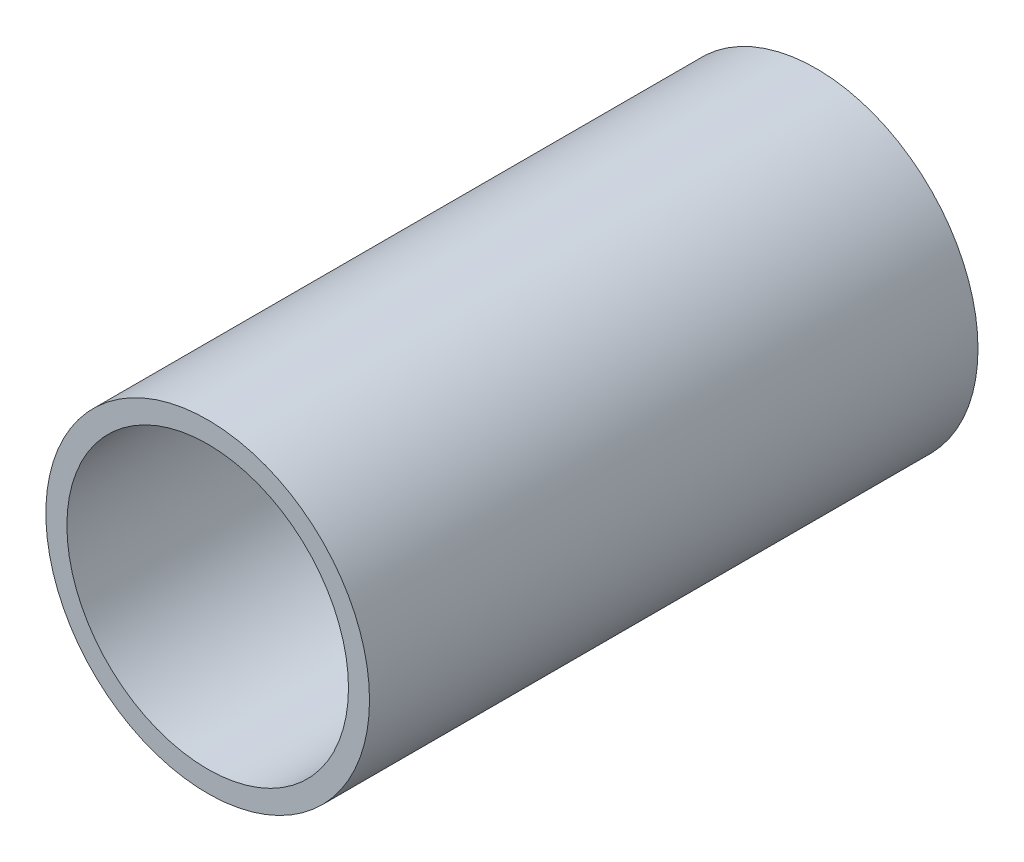
ISO-10303-21;
HEADER;
FILE_DESCRIPTION(('STEP AP214'),'2;1');
FILE_NAME('part.step','',(''),(''),'','','');
FILE_SCHEMA(('AUTOMOTIVE_DESIGN { 1 0 10303 214 1 1 1 1 }'));
ENDSEC;
DATA;
#1=APPLICATION_CONTEXT('core data for automotive mechanical design processes');
#2=APPLICATION_PROTOCOL_DEFINITION('international standard','automotive_design',2000,#1);
#3=PRODUCT_CONTEXT('',#1,'mechanical');
#4=PRODUCT('Part','Part','',(#3));
#5=PRODUCT_RELATED_PRODUCT_CATEGORY('part','',(#4));
#6=PRODUCT_DEFINITION_FORMATION('','',#4);
#7=PRODUCT_DEFINITION_CONTEXT('part definition',#1,'design');
#8=PRODUCT_DEFINITION('design','',#6,#7);
#9=PRODUCT_DEFINITION_SHAPE('','',#8);
#10=(LENGTH_UNIT() NAMED_UNIT(*) SI_UNIT(.MILLI.,.METRE.));
#11=(NAMED_UNIT(*) PLANE_ANGLE_UNIT() SI_UNIT($,.RADIAN.));
#12=(NAMED_UNIT(*) SI_UNIT($,.STERADIAN.) SOLID_ANGLE_UNIT());
#13=UNCERTAINTY_MEASURE_WITH_UNIT(LENGTH_MEASURE(1.E-05),#10,'distance_accuracy_value','');
#14=(GEOMETRIC_REPRESENTATION_CONTEXT(3) GLOBAL_UNCERTAINTY_ASSIGNED_CONTEXT((#13)) GLOBAL_UNIT_ASSIGNED_CONTEXT((#10,
#11,#12)) REPRESENTATION_CONTEXT('',''));
#15=CARTESIAN_POINT('',(0.,0.,0.));
#16=DIRECTION('',(0.,0.,1.));
#17=DIRECTION('',(1.,0.,0.));
#18=AXIS2_PLACEMENT_3D('',#15,#16,#17);
#19=CARTESIAN_POINT('',(0.,0.,23.876));
#20=DIRECTION('',(0.,0.,1.));
#21=DIRECTION('',(-1.,0.,0.));
#22=AXIS2_PLACEMENT_3D('',#19,#20,#21);
#23=CYLINDRICAL_SURFACE('',#22,12.7);
#24=CARTESIAN_POINT('',(0.,0.,-23.876));
#25=DIRECTION('',(0.,0.,-1.));
#26=DIRECTION('',(1.,0.,0.));
#27=AXIS2_PLACEMENT_3D('',#24,#25,#26);
#28=CIRCLE('',#27,12.7);
#29=CARTESIAN_POINT('',(12.7,0.,-23.876));
#30=VERTEX_POINT('',#29);
#31=EDGE_CURVE('E39',#30,#30,#28,.T.);
#32=ORIENTED_EDGE('',*,*,#31,.F.);
#33=EDGE_LOOP('',(#32));
#34=FACE_BOUND('',#33,.T.);
#35=CARTESIAN_POINT('',(0.,0.,23.876));
#36=DIRECTION('',(0.,0.,-1.));
#37=DIRECTION('',(1.,0.,0.));
#38=AXIS2_PLACEMENT_3D('',#35,#36,#37);
#39=CIRCLE('',#38,12.7);
#40=CARTESIAN_POINT('',(12.7,0.,23.876));
#41=VERTEX_POINT('',#40);
#42=EDGE_CURVE('E11',#41,#41,#39,.T.);
#43=ORIENTED_EDGE('',*,*,#42,.T.);
#44=EDGE_LOOP('',(#43));
#45=FACE_BOUND('',#44,.T.);
#46=ADVANCED_FACE('F17',(#34,#45),#23,.T.);
#47=CARTESIAN_POINT('',(0.,0.,23.876));
#48=DIRECTION('',(0.,0.,1.));
#49=DIRECTION('',(-1.,0.,0.));
#50=AXIS2_PLACEMENT_3D('',#47,#48,#49);
#51=CYLINDRICAL_SURFACE('',#50,11.049);
#52=CARTESIAN_POINT('',(0.,0.,-23.876));
#53=DIRECTION('',(0.,0.,-1.));
#54=DIRECTION('',(-1.,0.,0.));
#55=AXIS2_PLACEMENT_3D('',#52,#53,#54);
#56=CIRCLE('',#55,11.049);
#57=CARTESIAN_POINT('',(-11.049,0.,-23.876));
#58=VERTEX_POINT('',#57);
#59=EDGE_CURVE('E27',#58,#58,#56,.T.);
#60=ORIENTED_EDGE('',*,*,#59,.T.);
#61=EDGE_LOOP('',(#60));
#62=FACE_BOUND('',#61,.T.);
#63=CARTESIAN_POINT('',(0.,0.,23.876));
#64=DIRECTION('',(0.,0.,-1.));
#65=DIRECTION('',(-1.,0.,0.));
#66=AXIS2_PLACEMENT_3D('',#63,#64,#65);
#67=CIRCLE('',#66,11.049);
#68=CARTESIAN_POINT('',(-11.049,0.,23.876));
#69=VERTEX_POINT('',#68);
#70=EDGE_CURVE('E20',#69,#69,#67,.T.);
#71=ORIENTED_EDGE('',*,*,#70,.F.);
#72=EDGE_LOOP('',(#71));
#73=FACE_BOUND('',#72,.T.);
#74=ADVANCED_FACE('F54',(#62,#73),#51,.F.);
#75=CARTESIAN_POINT('',(0.,0.,-23.876));
#76=DIRECTION('',(0.,0.,-1.));
#77=DIRECTION('',(0.,-1.,0.));
#78=AXIS2_PLACEMENT_3D('',#75,#76,#77);
#79=PLANE('',#78);
#80=ORIENTED_EDGE('',*,*,#31,.T.);
#81=EDGE_LOOP('',(#80));
#82=FACE_BOUND('',#81,.T.);
#83=ORIENTED_EDGE('',*,*,#59,.F.);
#84=EDGE_LOOP('',(#83));
#85=FACE_BOUND('',#84,.T.);
#86=ADVANCED_FACE('F67',(#82,#85),#79,.T.);
#87=CARTESIAN_POINT('',(0.,0.,23.876));
#88=DIRECTION('',(0.,0.,-1.));
#89=DIRECTION('',(0.,-1.,0.));
#90=AXIS2_PLACEMENT_3D('',#87,#88,#89);
#91=PLANE('',#90);
#92=ORIENTED_EDGE('',*,*,#42,.F.);
#93=EDGE_LOOP('',(#92));
#94=FACE_BOUND('',#93,.T.);
#95=ORIENTED_EDGE('',*,*,#70,.T.);
#96=EDGE_LOOP('',(#95));
#97=FACE_BOUND('',#96,.T.);
#98=ADVANCED_FACE('F75',(#94,#97),#91,.F.);
#99=CLOSED_SHELL('',(#46,#74,#86,#98));
#100=MANIFOLD_SOLID_BREP('B1',#99);
#101=ADVANCED_BREP_SHAPE_REPRESENTATION('',(#18,#100),#14);
#102=SHAPE_DEFINITION_REPRESENTATION(#9,#101);
ENDSEC;
END-ISO-10303-21;
